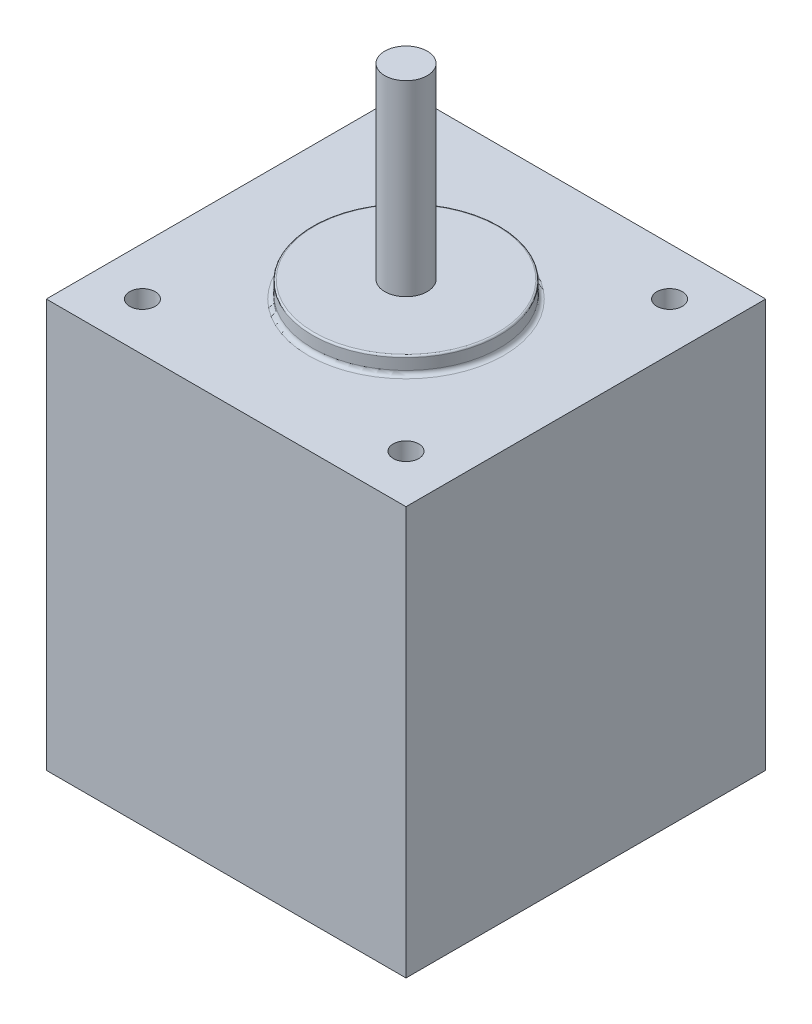
ISO-10303-21;
HEADER;
FILE_DESCRIPTION(('STEP AP214'),'2;1');
FILE_NAME('part.step','',(''),(''),'','','');
FILE_SCHEMA(('AUTOMOTIVE_DESIGN { 1 0 10303 214 1 1 1 1 }'));
ENDSEC;
DATA;
#1=APPLICATION_CONTEXT('core data for automotive mechanical design processes');
#2=APPLICATION_PROTOCOL_DEFINITION('international standard','automotive_design',2000,#1);
#3=PRODUCT_CONTEXT('',#1,'mechanical');
#4=PRODUCT('Part','Part','',(#3));
#5=PRODUCT_RELATED_PRODUCT_CATEGORY('part','',(#4));
#6=PRODUCT_DEFINITION_FORMATION('','',#4);
#7=PRODUCT_DEFINITION_CONTEXT('part definition',#1,'design');
#8=PRODUCT_DEFINITION('design','',#6,#7);
#9=PRODUCT_DEFINITION_SHAPE('','',#8);
#10=(LENGTH_UNIT() NAMED_UNIT(*) SI_UNIT(.MILLI.,.METRE.));
#11=(NAMED_UNIT(*) PLANE_ANGLE_UNIT() SI_UNIT($,.RADIAN.));
#12=(NAMED_UNIT(*) SI_UNIT($,.STERADIAN.) SOLID_ANGLE_UNIT());
#13=UNCERTAINTY_MEASURE_WITH_UNIT(LENGTH_MEASURE(1.E-05),#10,'distance_accuracy_value','');
#14=(GEOMETRIC_REPRESENTATION_CONTEXT(3) GLOBAL_UNCERTAINTY_ASSIGNED_CONTEXT((#13)) GLOBAL_UNIT_ASSIGNED_CONTEXT((#10,
#11,#12)) REPRESENTATION_CONTEXT('',''));
#15=CARTESIAN_POINT('',(0.,0.,0.));
#16=DIRECTION('',(0.,0.,1.));
#17=DIRECTION('',(1.,0.,0.));
#18=AXIS2_PLACEMENT_3D('',#15,#16,#17);
#19=CARTESIAN_POINT('',(21.15,-48.,-21.15));
#20=DIRECTION('',(1.,0.,0.));
#21=DIRECTION('',(0.,0.,-1.));
#22=AXIS2_PLACEMENT_3D('',#19,#20,#21);
#23=PLANE('',#22);
#24=DIRECTION('',(0.,0.,-1.));
#25=VECTOR('',#24,1.);
#26=CARTESIAN_POINT('',(21.15,0.,-21.15));
#27=LINE('',#26,#25);
#28=CARTESIAN_POINT('',(21.15,0.,21.15));
#29=VERTEX_POINT('',#28);
#30=CARTESIAN_POINT('',(21.15,0.,-21.15));
#31=VERTEX_POINT('',#30);
#32=EDGE_CURVE('E102',#29,#31,#27,.T.);
#33=ORIENTED_EDGE('',*,*,#32,.F.);
#34=DIRECTION('',(0.,1.,0.));
#35=VECTOR('',#34,1.);
#36=CARTESIAN_POINT('',(21.15,-48.,21.15));
#37=LINE('',#36,#35);
#38=CARTESIAN_POINT('',(21.15,-48.,21.15));
#39=VERTEX_POINT('',#38);
#40=EDGE_CURVE('E50',#39,#29,#37,.T.);
#41=ORIENTED_EDGE('',*,*,#40,.F.);
#42=DIRECTION('',(0.,0.,-1.));
#43=VECTOR('',#42,1.);
#44=CARTESIAN_POINT('',(21.15,-48.,-21.15));
#45=LINE('',#44,#43);
#46=CARTESIAN_POINT('',(21.15,-48.,-21.15));
#47=VERTEX_POINT('',#46);
#48=EDGE_CURVE('E95',#39,#47,#45,.T.);
#49=ORIENTED_EDGE('',*,*,#48,.T.);
#50=DIRECTION('',(0.,1.,0.));
#51=VECTOR('',#50,1.);
#52=CARTESIAN_POINT('',(21.15,-48.,-21.15));
#53=LINE('',#52,#51);
#54=EDGE_CURVE('E78',#47,#31,#53,.T.);
#55=ORIENTED_EDGE('',*,*,#54,.T.);
#56=EDGE_LOOP('',(#33,#41,#49,#55));
#57=FACE_BOUND('',#56,.T.);
#58=ADVANCED_FACE('F33',(#57),#23,.T.);
#59=CARTESIAN_POINT('',(-21.15,-48.,21.15));
#60=DIRECTION('',(0.,0.,1.));
#61=DIRECTION('',(1.,0.,0.));
#62=AXIS2_PLACEMENT_3D('',#59,#60,#61);
#63=PLANE('',#62);
#64=DIRECTION('',(1.,0.,0.));
#65=VECTOR('',#64,1.);
#66=CARTESIAN_POINT('',(-21.15,0.,21.15));
#67=LINE('',#66,#65);
#68=CARTESIAN_POINT('',(-21.15,0.,21.15));
#69=VERTEX_POINT('',#68);
#70=EDGE_CURVE('E97',#69,#29,#67,.T.);
#71=ORIENTED_EDGE('',*,*,#70,.F.);
#72=DIRECTION('',(0.,1.,0.));
#73=VECTOR('',#72,1.);
#74=CARTESIAN_POINT('',(-21.15,-48.,21.15));
#75=LINE('',#74,#73);
#76=CARTESIAN_POINT('',(-21.15,-48.,21.15));
#77=VERTEX_POINT('',#76);
#78=EDGE_CURVE('E67',#77,#69,#75,.T.);
#79=ORIENTED_EDGE('',*,*,#78,.F.);
#80=DIRECTION('',(1.,0.,0.));
#81=VECTOR('',#80,1.);
#82=CARTESIAN_POINT('',(-21.15,-48.,21.15));
#83=LINE('',#82,#81);
#84=EDGE_CURVE('E92',#77,#39,#83,.T.);
#85=ORIENTED_EDGE('',*,*,#84,.T.);
#86=ORIENTED_EDGE('',*,*,#40,.T.);
#87=EDGE_LOOP('',(#71,#79,#85,#86));
#88=FACE_BOUND('',#87,.T.);
#89=ADVANCED_FACE('F140',(#88),#63,.T.);
#90=CARTESIAN_POINT('',(-21.15,-48.,-21.15));
#91=DIRECTION('',(-1.,0.,0.));
#92=DIRECTION('',(0.,0.,1.));
#93=AXIS2_PLACEMENT_3D('',#90,#91,#92);
#94=PLANE('',#93);
#95=DIRECTION('',(0.,0.,1.));
#96=VECTOR('',#95,1.);
#97=CARTESIAN_POINT('',(-21.15,0.,-21.15));
#98=LINE('',#97,#96);
#99=CARTESIAN_POINT('',(-21.15,0.,-21.15));
#100=VERTEX_POINT('',#99);
#101=EDGE_CURVE('E86',#100,#69,#98,.T.);
#102=ORIENTED_EDGE('',*,*,#101,.F.);
#103=DIRECTION('',(0.,1.,0.));
#104=VECTOR('',#103,1.);
#105=CARTESIAN_POINT('',(-21.15,-48.,-21.15));
#106=LINE('',#105,#104);
#107=CARTESIAN_POINT('',(-21.15,-48.,-21.15));
#108=VERTEX_POINT('',#107);
#109=EDGE_CURVE('E81',#108,#100,#106,.T.);
#110=ORIENTED_EDGE('',*,*,#109,.F.);
#111=DIRECTION('',(0.,0.,1.));
#112=VECTOR('',#111,1.);
#113=CARTESIAN_POINT('',(-21.15,-48.,-21.15));
#114=LINE('',#113,#112);
#115=EDGE_CURVE('E84',#108,#77,#114,.T.);
#116=ORIENTED_EDGE('',*,*,#115,.T.);
#117=ORIENTED_EDGE('',*,*,#78,.T.);
#118=EDGE_LOOP('',(#102,#110,#116,#117));
#119=FACE_BOUND('',#118,.T.);
#120=ADVANCED_FACE('F83',(#119),#94,.T.);
#121=CARTESIAN_POINT('',(-21.15,-48.,-21.15));
#122=DIRECTION('',(0.,0.,-1.));
#123=DIRECTION('',(-1.,0.,0.));
#124=AXIS2_PLACEMENT_3D('',#121,#122,#123);
#125=PLANE('',#124);
#126=DIRECTION('',(-1.,0.,0.));
#127=VECTOR('',#126,1.);
#128=CARTESIAN_POINT('',(-21.15,0.,-21.15));
#129=LINE('',#128,#127);
#130=EDGE_CURVE('E105',#31,#100,#129,.T.);
#131=ORIENTED_EDGE('',*,*,#130,.F.);
#132=ORIENTED_EDGE('',*,*,#54,.F.);
#133=DIRECTION('',(-1.,0.,0.));
#134=VECTOR('',#133,1.);
#135=CARTESIAN_POINT('',(-21.15,-48.,-21.15));
#136=LINE('',#135,#134);
#137=EDGE_CURVE('E91',#47,#108,#136,.T.);
#138=ORIENTED_EDGE('',*,*,#137,.T.);
#139=ORIENTED_EDGE('',*,*,#109,.T.);
#140=EDGE_LOOP('',(#131,#132,#138,#139));
#141=FACE_BOUND('',#140,.T.);
#142=ADVANCED_FACE('F94',(#141),#125,.T.);
#143=CARTESIAN_POINT('',(0.,-48.,0.));
#144=DIRECTION('',(0.,1.,0.));
#145=DIRECTION('',(0.,0.,1.));
#146=AXIS2_PLACEMENT_3D('',#143,#144,#145);
#147=PLANE('',#146);
#148=CARTESIAN_POINT('',(15.5,-48.,15.5));
#149=DIRECTION('',(0.,1.,0.));
#150=DIRECTION('',(0.,0.,1.));
#151=AXIS2_PLACEMENT_3D('',#148,#149,#150);
#152=CIRCLE('',#151,1.5);
#153=CARTESIAN_POINT('',(15.5,-48.,17.));
#154=VERTEX_POINT('',#153);
#155=EDGE_CURVE('E193',#154,#154,#152,.T.);
#156=ORIENTED_EDGE('',*,*,#155,.T.);
#157=EDGE_LOOP('',(#156));
#158=FACE_BOUND('',#157,.T.);
#159=CARTESIAN_POINT('',(-15.5,-48.,15.5));
#160=DIRECTION('',(0.,1.,0.));
#161=DIRECTION('',(0.,0.,1.));
#162=AXIS2_PLACEMENT_3D('',#159,#160,#161);
#163=CIRCLE('',#162,1.5);
#164=CARTESIAN_POINT('',(-15.5,-48.,17.));
#165=VERTEX_POINT('',#164);
#166=EDGE_CURVE('E199',#165,#165,#163,.T.);
#167=ORIENTED_EDGE('',*,*,#166,.T.);
#168=EDGE_LOOP('',(#167));
#169=FACE_BOUND('',#168,.T.);
#170=CARTESIAN_POINT('',(-15.5,-48.,-15.5));
#171=DIRECTION('',(0.,1.,0.));
#172=DIRECTION('',(0.,0.,1.));
#173=AXIS2_PLACEMENT_3D('',#170,#171,#172);
#174=CIRCLE('',#173,1.5);
#175=CARTESIAN_POINT('',(-15.5,-48.,-14.));
#176=VERTEX_POINT('',#175);
#177=EDGE_CURVE('E205',#176,#176,#174,.T.);
#178=ORIENTED_EDGE('',*,*,#177,.T.);
#179=EDGE_LOOP('',(#178));
#180=FACE_BOUND('',#179,.T.);
#181=CARTESIAN_POINT('',(15.5,-48.,-15.5));
#182=DIRECTION('',(0.,1.,0.));
#183=DIRECTION('',(0.,0.,1.));
#184=AXIS2_PLACEMENT_3D('',#181,#182,#183);
#185=CIRCLE('',#184,1.5);
#186=CARTESIAN_POINT('',(15.5,-48.,-14.));
#187=VERTEX_POINT('',#186);
#188=EDGE_CURVE('E106',#187,#187,#185,.T.);
#189=ORIENTED_EDGE('',*,*,#188,.T.);
#190=EDGE_LOOP('',(#189));
#191=FACE_BOUND('',#190,.T.);
#192=ORIENTED_EDGE('',*,*,#48,.F.);
#193=ORIENTED_EDGE('',*,*,#84,.F.);
#194=ORIENTED_EDGE('',*,*,#115,.F.);
#195=ORIENTED_EDGE('',*,*,#137,.F.);
#196=EDGE_LOOP('',(#192,#193,#194,#195));
#197=FACE_BOUND('',#196,.T.);
#198=ADVANCED_FACE('F90',(#158,#169,#180,#191,#197),#147,.F.);
#199=CARTESIAN_POINT('',(0.,0.,0.));
#200=DIRECTION('',(0.,1.,0.));
#201=DIRECTION('',(0.,0.,1.));
#202=AXIS2_PLACEMENT_3D('',#199,#200,#201);
#203=PLANE('',#202);
#204=CARTESIAN_POINT('',(0.,0.,0.));
#205=DIRECTION('',(0.,1.,0.));
#206=DIRECTION('',(0.,0.,1.));
#207=AXIS2_PLACEMENT_3D('',#204,#205,#206);
#208=CIRCLE('',#207,11.5);
#209=CARTESIAN_POINT('',(0.,0.,11.5));
#210=VERTEX_POINT('',#209);
#211=EDGE_CURVE('E122',#210,#210,#208,.F.);
#212=ORIENTED_EDGE('',*,*,#211,.T.);
#213=EDGE_LOOP('',(#212));
#214=FACE_BOUND('',#213,.T.);
#215=CARTESIAN_POINT('',(15.5,0.,15.5));
#216=DIRECTION('',(0.,1.,0.));
#217=DIRECTION('',(0.,0.,1.));
#218=AXIS2_PLACEMENT_3D('',#215,#216,#217);
#219=CIRCLE('',#218,1.5);
#220=CARTESIAN_POINT('',(15.5,0.,17.));
#221=VERTEX_POINT('',#220);
#222=EDGE_CURVE('E118',#221,#221,#219,.T.);
#223=ORIENTED_EDGE('',*,*,#222,.F.);
#224=EDGE_LOOP('',(#223));
#225=FACE_BOUND('',#224,.T.);
#226=CARTESIAN_POINT('',(-15.5,0.,15.5));
#227=DIRECTION('',(0.,1.,0.));
#228=DIRECTION('',(0.,0.,1.));
#229=AXIS2_PLACEMENT_3D('',#226,#227,#228);
#230=CIRCLE('',#229,1.5);
#231=CARTESIAN_POINT('',(-15.5,0.,17.));
#232=VERTEX_POINT('',#231);
#233=EDGE_CURVE('E196',#232,#232,#230,.T.);
#234=ORIENTED_EDGE('',*,*,#233,.F.);
#235=EDGE_LOOP('',(#234));
#236=FACE_BOUND('',#235,.T.);
#237=CARTESIAN_POINT('',(-15.5,0.,-15.5));
#238=DIRECTION('',(0.,1.,0.));
#239=DIRECTION('',(0.,0.,1.));
#240=AXIS2_PLACEMENT_3D('',#237,#238,#239);
#241=CIRCLE('',#240,1.5);
#242=CARTESIAN_POINT('',(-15.5,0.,-14.));
#243=VERTEX_POINT('',#242);
#244=EDGE_CURVE('E202',#243,#243,#241,.T.);
#245=ORIENTED_EDGE('',*,*,#244,.F.);
#246=EDGE_LOOP('',(#245));
#247=FACE_BOUND('',#246,.T.);
#248=CARTESIAN_POINT('',(15.5,0.,-15.5));
#249=DIRECTION('',(0.,1.,0.));
#250=DIRECTION('',(0.,0.,1.));
#251=AXIS2_PLACEMENT_3D('',#248,#249,#250);
#252=CIRCLE('',#251,1.5);
#253=CARTESIAN_POINT('',(15.5,0.,-14.));
#254=VERTEX_POINT('',#253);
#255=EDGE_CURVE('E208',#254,#254,#252,.T.);
#256=ORIENTED_EDGE('',*,*,#255,.F.);
#257=EDGE_LOOP('',(#256));
#258=FACE_BOUND('',#257,.T.);
#259=ORIENTED_EDGE('',*,*,#32,.T.);
#260=ORIENTED_EDGE('',*,*,#130,.T.);
#261=ORIENTED_EDGE('',*,*,#101,.T.);
#262=ORIENTED_EDGE('',*,*,#70,.T.);
#263=EDGE_LOOP('',(#259,#260,#261,#262));
#264=FACE_BOUND('',#263,.T.);
#265=ADVANCED_FACE('F151',(#214,#225,#236,#247,#258,#264),#203,.T.);
#266=CARTESIAN_POINT('',(15.5,-48.,-15.5));
#267=DIRECTION('',(0.,1.,0.));
#268=DIRECTION('',(0.,0.,1.));
#269=AXIS2_PLACEMENT_3D('',#266,#267,#268);
#270=CYLINDRICAL_SURFACE('',#269,1.5);
#271=ORIENTED_EDGE('',*,*,#188,.F.);
#272=EDGE_LOOP('',(#271));
#273=FACE_BOUND('',#272,.T.);
#274=ORIENTED_EDGE('',*,*,#255,.T.);
#275=EDGE_LOOP('',(#274));
#276=FACE_BOUND('',#275,.T.);
#277=ADVANCED_FACE('F154',(#273,#276),#270,.F.);
#278=CARTESIAN_POINT('',(-15.5,-48.,-15.5));
#279=DIRECTION('',(0.,1.,0.));
#280=DIRECTION('',(0.,0.,1.));
#281=AXIS2_PLACEMENT_3D('',#278,#279,#280);
#282=CYLINDRICAL_SURFACE('',#281,1.5);
#283=ORIENTED_EDGE('',*,*,#177,.F.);
#284=EDGE_LOOP('',(#283));
#285=FACE_BOUND('',#284,.T.);
#286=ORIENTED_EDGE('',*,*,#244,.T.);
#287=EDGE_LOOP('',(#286));
#288=FACE_BOUND('',#287,.T.);
#289=ADVANCED_FACE('F161',(#285,#288),#282,.F.);
#290=CARTESIAN_POINT('',(-15.5,-48.,15.5));
#291=DIRECTION('',(0.,1.,0.));
#292=DIRECTION('',(0.,0.,1.));
#293=AXIS2_PLACEMENT_3D('',#290,#291,#292);
#294=CYLINDRICAL_SURFACE('',#293,1.5);
#295=ORIENTED_EDGE('',*,*,#166,.F.);
#296=EDGE_LOOP('',(#295));
#297=FACE_BOUND('',#296,.T.);
#298=ORIENTED_EDGE('',*,*,#233,.T.);
#299=EDGE_LOOP('',(#298));
#300=FACE_BOUND('',#299,.T.);
#301=ADVANCED_FACE('F165',(#297,#300),#294,.F.);
#302=CARTESIAN_POINT('',(15.5,-48.,15.5));
#303=DIRECTION('',(0.,1.,0.));
#304=DIRECTION('',(0.,0.,1.));
#305=AXIS2_PLACEMENT_3D('',#302,#303,#304);
#306=CYLINDRICAL_SURFACE('',#305,1.5);
#307=ORIENTED_EDGE('',*,*,#155,.F.);
#308=EDGE_LOOP('',(#307));
#309=FACE_BOUND('',#308,.T.);
#310=ORIENTED_EDGE('',*,*,#222,.T.);
#311=EDGE_LOOP('',(#310));
#312=FACE_BOUND('',#311,.T.);
#313=ADVANCED_FACE('F169',(#309,#312),#306,.F.);
#314=CARTESIAN_POINT('',(0.,2.,0.));
#315=DIRECTION('',(0.,-1.,0.));
#316=DIRECTION('',(0.,0.,-1.));
#317=AXIS2_PLACEMENT_3D('',#314,#315,#316);
#318=CYLINDRICAL_SURFACE('',#317,11.);
#319=CARTESIAN_POINT('',(0.,1.8,0.));
#320=DIRECTION('',(0.,1.,0.));
#321=DIRECTION('',(0.,0.,1.));
#322=AXIS2_PLACEMENT_3D('',#319,#320,#321);
#323=CIRCLE('',#322,11.);
#324=CARTESIAN_POINT('',(0.,1.8,11.));
#325=VERTEX_POINT('',#324);
#326=EDGE_CURVE('E11',#325,#325,#323,.F.);
#327=ORIENTED_EDGE('',*,*,#326,.T.);
#328=EDGE_LOOP('',(#327));
#329=FACE_BOUND('',#328,.T.);
#330=CARTESIAN_POINT('',(0.,0.5,0.));
#331=DIRECTION('',(0.,1.,0.));
#332=DIRECTION('',(0.,0.,1.));
#333=AXIS2_PLACEMENT_3D('',#330,#331,#332);
#334=CIRCLE('',#333,11.);
#335=CARTESIAN_POINT('',(0.,0.5,11.));
#336=VERTEX_POINT('',#335);
#337=EDGE_CURVE('E112',#336,#336,#334,.T.);
#338=ORIENTED_EDGE('',*,*,#337,.T.);
#339=EDGE_LOOP('',(#338));
#340=FACE_BOUND('',#339,.T.);
#341=ADVANCED_FACE('F173',(#329,#340),#318,.T.);
#342=CARTESIAN_POINT('',(0.,2.,0.));
#343=DIRECTION('',(0.,1.,0.));
#344=DIRECTION('',(0.,0.,1.));
#345=AXIS2_PLACEMENT_3D('',#342,#343,#344);
#346=PLANE('',#345);
#347=CARTESIAN_POINT('',(0.,2.,0.));
#348=DIRECTION('',(0.,1.,0.));
#349=DIRECTION('',(0.,0.,1.));
#350=AXIS2_PLACEMENT_3D('',#347,#348,#349);
#351=CIRCLE('',#350,10.8);
#352=CARTESIAN_POINT('',(0.,2.,10.8));
#353=VERTEX_POINT('',#352);
#354=EDGE_CURVE('E42',#353,#353,#351,.T.);
#355=ORIENTED_EDGE('',*,*,#354,.T.);
#356=EDGE_LOOP('',(#355));
#357=FACE_BOUND('',#356,.T.);
#358=CARTESIAN_POINT('',(0.,2.,0.));
#359=DIRECTION('',(0.,1.,0.));
#360=DIRECTION('',(0.,0.,1.));
#361=AXIS2_PLACEMENT_3D('',#358,#359,#360);
#362=CIRCLE('',#361,2.5);
#363=CARTESIAN_POINT('',(0.,2.,2.5));
#364=VERTEX_POINT('',#363);
#365=EDGE_CURVE('E115',#364,#364,#362,.F.);
#366=ORIENTED_EDGE('',*,*,#365,.T.);
#367=EDGE_LOOP('',(#366));
#368=FACE_BOUND('',#367,.T.);
#369=ADVANCED_FACE('F127',(#357,#368),#346,.T.);
#370=CARTESIAN_POINT('',(0.,24.,0.));
#371=DIRECTION('',(0.,-1.,0.));
#372=DIRECTION('',(0.,0.,-1.));
#373=AXIS2_PLACEMENT_3D('',#370,#371,#372);
#374=CYLINDRICAL_SURFACE('',#373,2.5);
#375=ORIENTED_EDGE('',*,*,#365,.F.);
#376=EDGE_LOOP('',(#375));
#377=FACE_BOUND('',#376,.T.);
#378=CARTESIAN_POINT('',(0.,24.,0.));
#379=DIRECTION('',(0.,1.,0.));
#380=DIRECTION('',(0.,0.,1.));
#381=AXIS2_PLACEMENT_3D('',#378,#379,#380);
#382=CIRCLE('',#381,2.5);
#383=CARTESIAN_POINT('',(0.,24.,2.5));
#384=VERTEX_POINT('',#383);
#385=EDGE_CURVE('E119',#384,#384,#382,.T.);
#386=ORIENTED_EDGE('',*,*,#385,.F.);
#387=EDGE_LOOP('',(#386));
#388=FACE_BOUND('',#387,.T.);
#389=ADVANCED_FACE('F180',(#377,#388),#374,.T.);
#390=CARTESIAN_POINT('',(0.,24.,0.));
#391=DIRECTION('',(0.,1.,0.));
#392=DIRECTION('',(0.,0.,1.));
#393=AXIS2_PLACEMENT_3D('',#390,#391,#392);
#394=PLANE('',#393);
#395=ORIENTED_EDGE('',*,*,#385,.T.);
#396=EDGE_LOOP('',(#395));
#397=FACE_BOUND('',#396,.T.);
#398=ADVANCED_FACE('F136',(#397),#394,.T.);
#399=CARTESIAN_POINT('',(0.,0.5,0.));
#400=DIRECTION('',(0.,1.,0.));
#401=DIRECTION('',(0.,0.,1.));
#402=AXIS2_PLACEMENT_3D('',#399,#400,#401);
#403=TOROIDAL_SURFACE('',#402,11.5,0.5);
#404=ORIENTED_EDGE('',*,*,#211,.F.);
#405=EDGE_LOOP('',(#404));
#406=FACE_BOUND('',#405,.T.);
#407=ORIENTED_EDGE('',*,*,#337,.F.);
#408=EDGE_LOOP('',(#407));
#409=FACE_BOUND('',#408,.T.);
#410=ADVANCED_FACE('F131',(#406,#409),#403,.F.);
#411=CARTESIAN_POINT('',(0.,1.8,0.));
#412=DIRECTION('',(0.,1.,0.));
#413=DIRECTION('',(0.,0.,1.));
#414=AXIS2_PLACEMENT_3D('',#411,#412,#413);
#415=TOROIDAL_SURFACE('',#414,10.8,0.2);
#416=ORIENTED_EDGE('',*,*,#326,.F.);
#417=EDGE_LOOP('',(#416));
#418=FACE_BOUND('',#417,.T.);
#419=ORIENTED_EDGE('',*,*,#354,.F.);
#420=EDGE_LOOP('',(#419));
#421=FACE_BOUND('',#420,.T.);
#422=ADVANCED_FACE('F35',(#418,#421),#415,.T.);
#423=CLOSED_SHELL('',(#58,#89,#120,#142,#198,#265,#277,#289,#301,#313,#341,#369,#389,#398,#410,#422));
#424=MANIFOLD_SOLID_BREP('B2',#423);
#425=ADVANCED_BREP_SHAPE_REPRESENTATION('',(#18,#424),#14);
#426=SHAPE_DEFINITION_REPRESENTATION(#9,#425);
ENDSEC;
END-ISO-10303-21;
